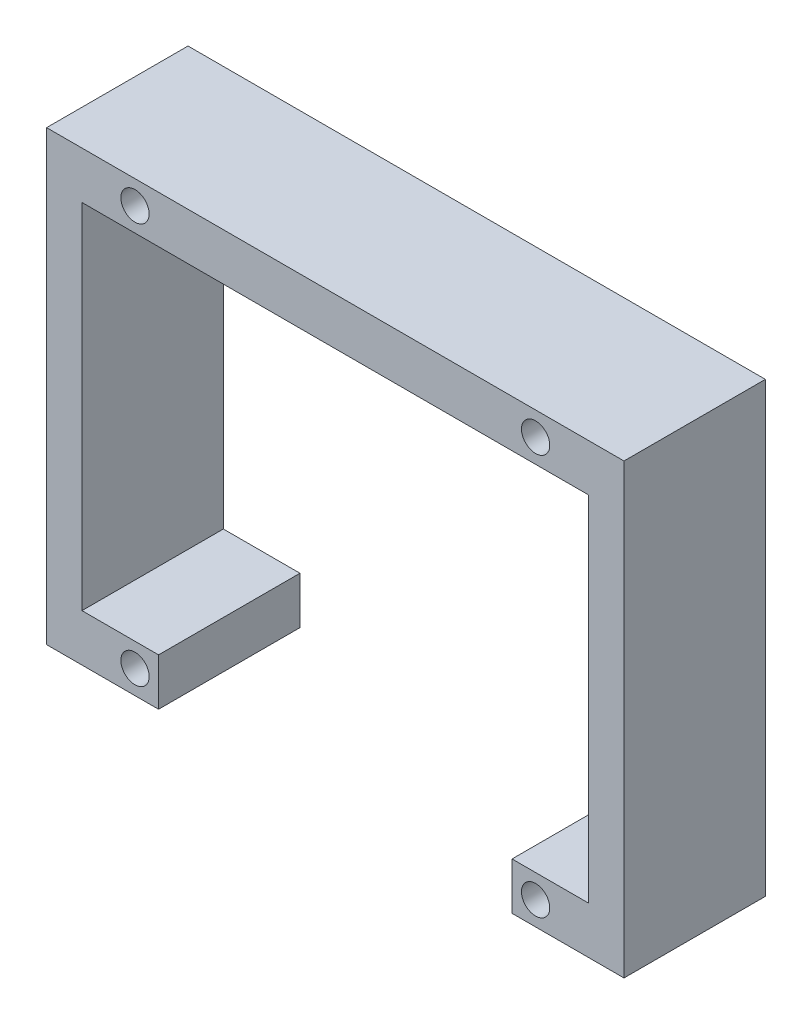
ISO-10303-21;
HEADER;
FILE_DESCRIPTION(('STEP AP214'),'2;1');
FILE_NAME('part.step','',(''),(''),'','','');
FILE_SCHEMA(('AUTOMOTIVE_DESIGN { 1 0 10303 214 1 1 1 1 }'));
ENDSEC;
DATA;
#1=APPLICATION_CONTEXT('core data for automotive mechanical design processes');
#2=APPLICATION_PROTOCOL_DEFINITION('international standard','automotive_design',2000,#1);
#3=PRODUCT_CONTEXT('',#1,'mechanical');
#4=PRODUCT('Part','Part','',(#3));
#5=PRODUCT_RELATED_PRODUCT_CATEGORY('part','',(#4));
#6=PRODUCT_DEFINITION_FORMATION('','',#4);
#7=PRODUCT_DEFINITION_CONTEXT('part definition',#1,'design');
#8=PRODUCT_DEFINITION('design','',#6,#7);
#9=PRODUCT_DEFINITION_SHAPE('','',#8);
#10=(LENGTH_UNIT() NAMED_UNIT(*) SI_UNIT(.MILLI.,.METRE.));
#11=(NAMED_UNIT(*) PLANE_ANGLE_UNIT() SI_UNIT($,.RADIAN.));
#12=(NAMED_UNIT(*) SI_UNIT($,.STERADIAN.) SOLID_ANGLE_UNIT());
#13=UNCERTAINTY_MEASURE_WITH_UNIT(LENGTH_MEASURE(1.E-05),#10,'distance_accuracy_value','');
#14=(GEOMETRIC_REPRESENTATION_CONTEXT(3) GLOBAL_UNCERTAINTY_ASSIGNED_CONTEXT((#13)) GLOBAL_UNIT_ASSIGNED_CONTEXT((#10,
#11,#12)) REPRESENTATION_CONTEXT('',''));
#15=CARTESIAN_POINT('',(0.,0.,0.));
#16=DIRECTION('',(0.,0.,1.));
#17=DIRECTION('',(1.,0.,0.));
#18=AXIS2_PLACEMENT_3D('',#15,#16,#17);
#19=CARTESIAN_POINT('',(0.,0.,12.));
#20=DIRECTION('',(0.,0.,1.));
#21=DIRECTION('',(1.,0.,0.));
#22=AXIS2_PLACEMENT_3D('',#19,#20,#21);
#23=PLANE('',#22);
#24=CARTESIAN_POINT('',(17.,17.,12.));
#25=DIRECTION('',(0.,0.,1.));
#26=DIRECTION('',(1.,0.,0.));
#27=AXIS2_PLACEMENT_3D('',#24,#25,#26);
#28=CIRCLE('',#27,1.2);
#29=CARTESIAN_POINT('',(18.2,17.,12.));
#30=VERTEX_POINT('',#29);
#31=EDGE_CURVE('E299',#30,#30,#28,.T.);
#32=ORIENTED_EDGE('',*,*,#31,.F.);
#33=EDGE_LOOP('',(#32));
#34=FACE_BOUND('',#33,.T.);
#35=CARTESIAN_POINT('',(-17.,17.,12.));
#36=DIRECTION('',(0.,0.,1.));
#37=DIRECTION('',(1.,0.,0.));
#38=AXIS2_PLACEMENT_3D('',#35,#36,#37);
#39=CIRCLE('',#38,1.2);
#40=CARTESIAN_POINT('',(-15.8,17.,12.));
#41=VERTEX_POINT('',#40);
#42=EDGE_CURVE('E166',#41,#41,#39,.T.);
#43=ORIENTED_EDGE('',*,*,#42,.F.);
#44=EDGE_LOOP('',(#43));
#45=FACE_BOUND('',#44,.T.);
#46=DIRECTION('',(1.,0.,0.));
#47=VECTOR('',#46,1.);
#48=CARTESIAN_POINT('',(-24.5,-19.,12.));
#49=LINE('',#48,#47);
#50=CARTESIAN_POINT('',(-24.5,-19.,12.));
#51=VERTEX_POINT('',#50);
#52=CARTESIAN_POINT('',(-15.,-19.,12.));
#53=VERTEX_POINT('',#52);
#54=EDGE_CURVE('E185',#51,#53,#49,.T.);
#55=ORIENTED_EDGE('',*,*,#54,.T.);
#56=DIRECTION('',(0.,1.,0.));
#57=VECTOR('',#56,1.);
#58=CARTESIAN_POINT('',(-15.,-19.,12.));
#59=LINE('',#58,#57);
#60=CARTESIAN_POINT('',(-15.,-15.,12.));
#61=VERTEX_POINT('',#60);
#62=EDGE_CURVE('E113',#53,#61,#59,.T.);
#63=ORIENTED_EDGE('',*,*,#62,.T.);
#64=DIRECTION('',(-1.,0.,0.));
#65=VECTOR('',#64,1.);
#66=CARTESIAN_POINT('',(-15.,-15.,12.));
#67=LINE('',#66,#65);
#68=CARTESIAN_POINT('',(-21.5,-15.,12.));
#69=VERTEX_POINT('',#68);
#70=EDGE_CURVE('E212',#61,#69,#67,.T.);
#71=ORIENTED_EDGE('',*,*,#70,.T.);
#72=DIRECTION('',(0.,1.,0.));
#73=VECTOR('',#72,1.);
#74=CARTESIAN_POINT('',(-21.5,-15.,12.));
#75=LINE('',#74,#73);
#76=CARTESIAN_POINT('',(-21.5,15.,12.));
#77=VERTEX_POINT('',#76);
#78=EDGE_CURVE('E231',#69,#77,#75,.T.);
#79=ORIENTED_EDGE('',*,*,#78,.T.);
#80=DIRECTION('',(1.,0.,0.));
#81=VECTOR('',#80,1.);
#82=CARTESIAN_POINT('',(-21.5,15.,12.));
#83=LINE('',#82,#81);
#84=CARTESIAN_POINT('',(21.5,15.,12.));
#85=VERTEX_POINT('',#84);
#86=EDGE_CURVE('E228',#77,#85,#83,.T.);
#87=ORIENTED_EDGE('',*,*,#86,.T.);
#88=DIRECTION('',(0.,-1.,0.));
#89=VECTOR('',#88,1.);
#90=CARTESIAN_POINT('',(21.5,15.,12.));
#91=LINE('',#90,#89);
#92=CARTESIAN_POINT('',(21.5,-15.,12.));
#93=VERTEX_POINT('',#92);
#94=EDGE_CURVE('E230',#85,#93,#91,.T.);
#95=ORIENTED_EDGE('',*,*,#94,.T.);
#96=DIRECTION('',(-1.,0.,0.));
#97=VECTOR('',#96,1.);
#98=CARTESIAN_POINT('',(21.5,-15.,12.));
#99=LINE('',#98,#97);
#100=CARTESIAN_POINT('',(15.,-15.,12.));
#101=VERTEX_POINT('',#100);
#102=EDGE_CURVE('E233',#93,#101,#99,.T.);
#103=ORIENTED_EDGE('',*,*,#102,.T.);
#104=DIRECTION('',(0.,-1.,0.));
#105=VECTOR('',#104,1.);
#106=CARTESIAN_POINT('',(15.,-15.,12.));
#107=LINE('',#106,#105);
#108=CARTESIAN_POINT('',(15.,-19.,12.));
#109=VERTEX_POINT('',#108);
#110=EDGE_CURVE('E239',#101,#109,#107,.T.);
#111=ORIENTED_EDGE('',*,*,#110,.T.);
#112=DIRECTION('',(1.,0.,0.));
#113=VECTOR('',#112,1.);
#114=CARTESIAN_POINT('',(15.,-19.,12.));
#115=LINE('',#114,#113);
#116=CARTESIAN_POINT('',(24.5,-19.,12.));
#117=VERTEX_POINT('',#116);
#118=EDGE_CURVE('E144',#109,#117,#115,.T.);
#119=ORIENTED_EDGE('',*,*,#118,.T.);
#120=DIRECTION('',(0.,1.,0.));
#121=VECTOR('',#120,1.);
#122=CARTESIAN_POINT('',(24.5,-19.,12.));
#123=LINE('',#122,#121);
#124=CARTESIAN_POINT('',(24.5,19.,12.));
#125=VERTEX_POINT('',#124);
#126=EDGE_CURVE('E138',#117,#125,#123,.T.);
#127=ORIENTED_EDGE('',*,*,#126,.T.);
#128=DIRECTION('',(-1.,0.,0.));
#129=VECTOR('',#128,1.);
#130=CARTESIAN_POINT('',(24.5,19.,12.));
#131=LINE('',#130,#129);
#132=CARTESIAN_POINT('',(-24.5,19.,12.));
#133=VERTEX_POINT('',#132);
#134=EDGE_CURVE('E142',#125,#133,#131,.T.);
#135=ORIENTED_EDGE('',*,*,#134,.T.);
#136=DIRECTION('',(0.,-1.,0.));
#137=VECTOR('',#136,1.);
#138=CARTESIAN_POINT('',(-24.5,19.,12.));
#139=LINE('',#138,#137);
#140=EDGE_CURVE('E58',#133,#51,#139,.T.);
#141=ORIENTED_EDGE('',*,*,#140,.T.);
#142=EDGE_LOOP('',(#55,#63,#71,#79,#87,#95,#103,#111,#119,#127,#135,#141));
#143=FACE_BOUND('',#142,.T.);
#144=CARTESIAN_POINT('',(-17.,-17.,12.));
#145=DIRECTION('',(0.,0.,1.));
#146=DIRECTION('',(1.,0.,0.));
#147=AXIS2_PLACEMENT_3D('',#144,#145,#146);
#148=CIRCLE('',#147,1.2);
#149=CARTESIAN_POINT('',(-15.8,-17.,12.));
#150=VERTEX_POINT('',#149);
#151=EDGE_CURVE('E305',#150,#150,#148,.T.);
#152=ORIENTED_EDGE('',*,*,#151,.F.);
#153=EDGE_LOOP('',(#152));
#154=FACE_BOUND('',#153,.T.);
#155=CARTESIAN_POINT('',(17.,-17.,12.));
#156=DIRECTION('',(0.,0.,1.));
#157=DIRECTION('',(1.,0.,0.));
#158=AXIS2_PLACEMENT_3D('',#155,#156,#157);
#159=CIRCLE('',#158,1.2);
#160=CARTESIAN_POINT('',(18.2,-17.,12.));
#161=VERTEX_POINT('',#160);
#162=EDGE_CURVE('E290',#161,#161,#159,.T.);
#163=ORIENTED_EDGE('',*,*,#162,.F.);
#164=EDGE_LOOP('',(#163));
#165=FACE_BOUND('',#164,.T.);
#166=ADVANCED_FACE('F41',(#34,#45,#143,#154,#165),#23,.T.);
#167=CARTESIAN_POINT('',(0.,0.,0.));
#168=DIRECTION('',(0.,0.,1.));
#169=DIRECTION('',(1.,0.,0.));
#170=AXIS2_PLACEMENT_3D('',#167,#168,#169);
#171=PLANE('',#170);
#172=DIRECTION('',(1.,0.,0.));
#173=VECTOR('',#172,1.);
#174=CARTESIAN_POINT('',(-24.5,-19.,0.));
#175=LINE('',#174,#173);
#176=CARTESIAN_POINT('',(-24.5,-19.,0.));
#177=VERTEX_POINT('',#176);
#178=CARTESIAN_POINT('',(-15.,-19.,0.));
#179=VERTEX_POINT('',#178);
#180=EDGE_CURVE('E162',#177,#179,#175,.T.);
#181=ORIENTED_EDGE('',*,*,#180,.F.);
#182=DIRECTION('',(0.,-1.,0.));
#183=VECTOR('',#182,1.);
#184=CARTESIAN_POINT('',(-24.5,19.,0.));
#185=LINE('',#184,#183);
#186=CARTESIAN_POINT('',(-24.5,19.,0.));
#187=VERTEX_POINT('',#186);
#188=EDGE_CURVE('E105',#187,#177,#185,.T.);
#189=ORIENTED_EDGE('',*,*,#188,.F.);
#190=DIRECTION('',(-1.,0.,0.));
#191=VECTOR('',#190,1.);
#192=CARTESIAN_POINT('',(24.5,19.,0.));
#193=LINE('',#192,#191);
#194=CARTESIAN_POINT('',(24.5,19.,0.));
#195=VERTEX_POINT('',#194);
#196=EDGE_CURVE('E99',#195,#187,#193,.T.);
#197=ORIENTED_EDGE('',*,*,#196,.F.);
#198=DIRECTION('',(0.,1.,0.));
#199=VECTOR('',#198,1.);
#200=CARTESIAN_POINT('',(24.5,-19.,0.));
#201=LINE('',#200,#199);
#202=CARTESIAN_POINT('',(24.5,-19.,0.));
#203=VERTEX_POINT('',#202);
#204=EDGE_CURVE('E152',#203,#195,#201,.T.);
#205=ORIENTED_EDGE('',*,*,#204,.F.);
#206=DIRECTION('',(1.,0.,0.));
#207=VECTOR('',#206,1.);
#208=CARTESIAN_POINT('',(15.,-19.,0.));
#209=LINE('',#208,#207);
#210=CARTESIAN_POINT('',(15.,-19.,0.));
#211=VERTEX_POINT('',#210);
#212=EDGE_CURVE('E180',#211,#203,#209,.T.);
#213=ORIENTED_EDGE('',*,*,#212,.F.);
#214=DIRECTION('',(0.,-1.,0.));
#215=VECTOR('',#214,1.);
#216=CARTESIAN_POINT('',(15.,-15.,0.));
#217=LINE('',#216,#215);
#218=CARTESIAN_POINT('',(15.,-15.,0.));
#219=VERTEX_POINT('',#218);
#220=EDGE_CURVE('E178',#219,#211,#217,.T.);
#221=ORIENTED_EDGE('',*,*,#220,.F.);
#222=DIRECTION('',(-1.,0.,0.));
#223=VECTOR('',#222,1.);
#224=CARTESIAN_POINT('',(21.5,-15.,0.));
#225=LINE('',#224,#223);
#226=CARTESIAN_POINT('',(21.5,-15.,0.));
#227=VERTEX_POINT('',#226);
#228=EDGE_CURVE('E176',#227,#219,#225,.T.);
#229=ORIENTED_EDGE('',*,*,#228,.F.);
#230=DIRECTION('',(0.,-1.,0.));
#231=VECTOR('',#230,1.);
#232=CARTESIAN_POINT('',(21.5,15.,0.));
#233=LINE('',#232,#231);
#234=CARTESIAN_POINT('',(21.5,15.,0.));
#235=VERTEX_POINT('',#234);
#236=EDGE_CURVE('E174',#235,#227,#233,.T.);
#237=ORIENTED_EDGE('',*,*,#236,.F.);
#238=DIRECTION('',(1.,0.,0.));
#239=VECTOR('',#238,1.);
#240=CARTESIAN_POINT('',(-21.5,15.,0.));
#241=LINE('',#240,#239);
#242=CARTESIAN_POINT('',(-21.5,15.,0.));
#243=VERTEX_POINT('',#242);
#244=EDGE_CURVE('E172',#243,#235,#241,.T.);
#245=ORIENTED_EDGE('',*,*,#244,.F.);
#246=DIRECTION('',(0.,1.,0.));
#247=VECTOR('',#246,1.);
#248=CARTESIAN_POINT('',(-21.5,-15.,0.));
#249=LINE('',#248,#247);
#250=CARTESIAN_POINT('',(-21.5,-15.,0.));
#251=VERTEX_POINT('',#250);
#252=EDGE_CURVE('E170',#251,#243,#249,.T.);
#253=ORIENTED_EDGE('',*,*,#252,.F.);
#254=DIRECTION('',(-1.,0.,0.));
#255=VECTOR('',#254,1.);
#256=CARTESIAN_POINT('',(-15.,-15.,0.));
#257=LINE('',#256,#255);
#258=CARTESIAN_POINT('',(-15.,-15.,0.));
#259=VERTEX_POINT('',#258);
#260=EDGE_CURVE('E168',#259,#251,#257,.T.);
#261=ORIENTED_EDGE('',*,*,#260,.F.);
#262=DIRECTION('',(0.,1.,0.));
#263=VECTOR('',#262,1.);
#264=CARTESIAN_POINT('',(-15.,-19.,0.));
#265=LINE('',#264,#263);
#266=EDGE_CURVE('E165',#179,#259,#265,.T.);
#267=ORIENTED_EDGE('',*,*,#266,.F.);
#268=EDGE_LOOP('',(#181,#189,#197,#205,#213,#221,#229,#237,#245,#253,#261,#267));
#269=FACE_BOUND('',#268,.T.);
#270=CARTESIAN_POINT('',(-17.,17.,0.));
#271=DIRECTION('',(0.,0.,1.));
#272=DIRECTION('',(1.,0.,0.));
#273=AXIS2_PLACEMENT_3D('',#270,#271,#272);
#274=CIRCLE('',#273,1.2);
#275=CARTESIAN_POINT('',(-15.8,17.,0.));
#276=VERTEX_POINT('',#275);
#277=EDGE_CURVE('E308',#276,#276,#274,.T.);
#278=ORIENTED_EDGE('',*,*,#277,.T.);
#279=EDGE_LOOP('',(#278));
#280=FACE_BOUND('',#279,.T.);
#281=CARTESIAN_POINT('',(-17.,-17.,0.));
#282=DIRECTION('',(0.,0.,1.));
#283=DIRECTION('',(1.,0.,0.));
#284=AXIS2_PLACEMENT_3D('',#281,#282,#283);
#285=CIRCLE('',#284,1.2);
#286=CARTESIAN_POINT('',(-15.8,-17.,0.));
#287=VERTEX_POINT('',#286);
#288=EDGE_CURVE('E302',#287,#287,#285,.T.);
#289=ORIENTED_EDGE('',*,*,#288,.T.);
#290=EDGE_LOOP('',(#289));
#291=FACE_BOUND('',#290,.T.);
#292=CARTESIAN_POINT('',(17.,17.,0.));
#293=DIRECTION('',(0.,0.,1.));
#294=DIRECTION('',(1.,0.,0.));
#295=AXIS2_PLACEMENT_3D('',#292,#293,#294);
#296=CIRCLE('',#295,1.2);
#297=CARTESIAN_POINT('',(18.2,17.,0.));
#298=VERTEX_POINT('',#297);
#299=EDGE_CURVE('E296',#298,#298,#296,.T.);
#300=ORIENTED_EDGE('',*,*,#299,.T.);
#301=EDGE_LOOP('',(#300));
#302=FACE_BOUND('',#301,.T.);
#303=CARTESIAN_POINT('',(17.,-17.,0.));
#304=DIRECTION('',(0.,0.,1.));
#305=DIRECTION('',(1.,0.,0.));
#306=AXIS2_PLACEMENT_3D('',#303,#304,#305);
#307=CIRCLE('',#306,1.2);
#308=CARTESIAN_POINT('',(18.2,-17.,0.));
#309=VERTEX_POINT('',#308);
#310=EDGE_CURVE('E293',#309,#309,#307,.T.);
#311=ORIENTED_EDGE('',*,*,#310,.T.);
#312=EDGE_LOOP('',(#311));
#313=FACE_BOUND('',#312,.T.);
#314=ADVANCED_FACE('F216',(#269,#280,#291,#302,#313),#171,.F.);
#315=CARTESIAN_POINT('',(-24.5,-19.,12.));
#316=DIRECTION('',(0.,1.,0.));
#317=DIRECTION('',(0.,0.,1.));
#318=AXIS2_PLACEMENT_3D('',#315,#316,#317);
#319=PLANE('',#318);
#320=ORIENTED_EDGE('',*,*,#180,.T.);
#321=DIRECTION('',(0.,0.,-1.));
#322=VECTOR('',#321,1.);
#323=CARTESIAN_POINT('',(-15.,-19.,12.));
#324=LINE('',#323,#322);
#325=EDGE_CURVE('E11',#53,#179,#324,.T.);
#326=ORIENTED_EDGE('',*,*,#325,.F.);
#327=ORIENTED_EDGE('',*,*,#54,.F.);
#328=DIRECTION('',(0.,0.,-1.));
#329=VECTOR('',#328,1.);
#330=CARTESIAN_POINT('',(-24.5,-19.,12.));
#331=LINE('',#330,#329);
#332=EDGE_CURVE('E158',#51,#177,#331,.T.);
#333=ORIENTED_EDGE('',*,*,#332,.T.);
#334=EDGE_LOOP('',(#320,#326,#327,#333));
#335=FACE_BOUND('',#334,.T.);
#336=ADVANCED_FACE('F43',(#335),#319,.F.);
#337=CARTESIAN_POINT('',(-15.,-19.,12.));
#338=DIRECTION('',(-1.,0.,0.));
#339=DIRECTION('',(0.,0.,1.));
#340=AXIS2_PLACEMENT_3D('',#337,#338,#339);
#341=PLANE('',#340);
#342=ORIENTED_EDGE('',*,*,#266,.T.);
#343=DIRECTION('',(0.,0.,-1.));
#344=VECTOR('',#343,1.);
#345=CARTESIAN_POINT('',(-15.,-15.,12.));
#346=LINE('',#345,#344);
#347=EDGE_CURVE('E50',#61,#259,#346,.T.);
#348=ORIENTED_EDGE('',*,*,#347,.F.);
#349=ORIENTED_EDGE('',*,*,#62,.F.);
#350=ORIENTED_EDGE('',*,*,#325,.T.);
#351=EDGE_LOOP('',(#342,#348,#349,#350));
#352=FACE_BOUND('',#351,.T.);
#353=ADVANCED_FACE('F422',(#352),#341,.F.);
#354=CARTESIAN_POINT('',(-15.,-15.,12.));
#355=DIRECTION('',(0.,-1.,0.));
#356=DIRECTION('',(1.,0.,0.));
#357=AXIS2_PLACEMENT_3D('',#354,#355,#356);
#358=PLANE('',#357);
#359=ORIENTED_EDGE('',*,*,#260,.T.);
#360=DIRECTION('',(0.,0.,-1.));
#361=VECTOR('',#360,1.);
#362=CARTESIAN_POINT('',(-21.5,-15.,12.));
#363=LINE('',#362,#361);
#364=EDGE_CURVE('E204',#69,#251,#363,.T.);
#365=ORIENTED_EDGE('',*,*,#364,.F.);
#366=ORIENTED_EDGE('',*,*,#70,.F.);
#367=ORIENTED_EDGE('',*,*,#347,.T.);
#368=EDGE_LOOP('',(#359,#365,#366,#367));
#369=FACE_BOUND('',#368,.T.);
#370=ADVANCED_FACE('F210',(#369),#358,.F.);
#371=CARTESIAN_POINT('',(-21.5,-15.,12.));
#372=DIRECTION('',(-1.,0.,0.));
#373=DIRECTION('',(0.,0.,1.));
#374=AXIS2_PLACEMENT_3D('',#371,#372,#373);
#375=PLANE('',#374);
#376=ORIENTED_EDGE('',*,*,#252,.T.);
#377=DIRECTION('',(0.,0.,-1.));
#378=VECTOR('',#377,1.);
#379=CARTESIAN_POINT('',(-21.5,15.,12.));
#380=LINE('',#379,#378);
#381=EDGE_CURVE('E201',#77,#243,#380,.T.);
#382=ORIENTED_EDGE('',*,*,#381,.F.);
#383=ORIENTED_EDGE('',*,*,#78,.F.);
#384=ORIENTED_EDGE('',*,*,#364,.T.);
#385=EDGE_LOOP('',(#376,#382,#383,#384));
#386=FACE_BOUND('',#385,.T.);
#387=ADVANCED_FACE('F222',(#386),#375,.F.);
#388=CARTESIAN_POINT('',(-21.5,15.,12.));
#389=DIRECTION('',(0.,1.,0.));
#390=DIRECTION('',(0.,0.,1.));
#391=AXIS2_PLACEMENT_3D('',#388,#389,#390);
#392=PLANE('',#391);
#393=ORIENTED_EDGE('',*,*,#244,.T.);
#394=DIRECTION('',(0.,0.,-1.));
#395=VECTOR('',#394,1.);
#396=CARTESIAN_POINT('',(21.5,15.,12.));
#397=LINE('',#396,#395);
#398=EDGE_CURVE('E198',#85,#235,#397,.T.);
#399=ORIENTED_EDGE('',*,*,#398,.F.);
#400=ORIENTED_EDGE('',*,*,#86,.F.);
#401=ORIENTED_EDGE('',*,*,#381,.T.);
#402=EDGE_LOOP('',(#393,#399,#400,#401));
#403=FACE_BOUND('',#402,.T.);
#404=ADVANCED_FACE('F226',(#403),#392,.F.);
#405=CARTESIAN_POINT('',(21.5,15.,12.));
#406=DIRECTION('',(1.,0.,0.));
#407=DIRECTION('',(0.,0.,-1.));
#408=AXIS2_PLACEMENT_3D('',#405,#406,#407);
#409=PLANE('',#408);
#410=ORIENTED_EDGE('',*,*,#236,.T.);
#411=DIRECTION('',(0.,0.,-1.));
#412=VECTOR('',#411,1.);
#413=CARTESIAN_POINT('',(21.5,-15.,12.));
#414=LINE('',#413,#412);
#415=EDGE_CURVE('E195',#93,#227,#414,.T.);
#416=ORIENTED_EDGE('',*,*,#415,.F.);
#417=ORIENTED_EDGE('',*,*,#94,.F.);
#418=ORIENTED_EDGE('',*,*,#398,.T.);
#419=EDGE_LOOP('',(#410,#416,#417,#418));
#420=FACE_BOUND('',#419,.T.);
#421=ADVANCED_FACE('F387',(#420),#409,.F.);
#422=CARTESIAN_POINT('',(21.5,-15.,12.));
#423=DIRECTION('',(0.,-1.,0.));
#424=DIRECTION('',(0.,0.,-1.));
#425=AXIS2_PLACEMENT_3D('',#422,#423,#424);
#426=PLANE('',#425);
#427=ORIENTED_EDGE('',*,*,#228,.T.);
#428=DIRECTION('',(0.,0.,-1.));
#429=VECTOR('',#428,1.);
#430=CARTESIAN_POINT('',(15.,-15.,12.));
#431=LINE('',#430,#429);
#432=EDGE_CURVE('E192',#101,#219,#431,.T.);
#433=ORIENTED_EDGE('',*,*,#432,.F.);
#434=ORIENTED_EDGE('',*,*,#102,.F.);
#435=ORIENTED_EDGE('',*,*,#415,.T.);
#436=EDGE_LOOP('',(#427,#433,#434,#435));
#437=FACE_BOUND('',#436,.T.);
#438=ADVANCED_FACE('F378',(#437),#426,.F.);
#439=CARTESIAN_POINT('',(15.,-15.,12.));
#440=DIRECTION('',(1.,0.,0.));
#441=DIRECTION('',(0.,1.,0.));
#442=AXIS2_PLACEMENT_3D('',#439,#440,#441);
#443=PLANE('',#442);
#444=ORIENTED_EDGE('',*,*,#220,.T.);
#445=DIRECTION('',(0.,0.,-1.));
#446=VECTOR('',#445,1.);
#447=CARTESIAN_POINT('',(15.,-19.,12.));
#448=LINE('',#447,#446);
#449=EDGE_CURVE('E189',#109,#211,#448,.T.);
#450=ORIENTED_EDGE('',*,*,#449,.F.);
#451=ORIENTED_EDGE('',*,*,#110,.F.);
#452=ORIENTED_EDGE('',*,*,#432,.T.);
#453=EDGE_LOOP('',(#444,#450,#451,#452));
#454=FACE_BOUND('',#453,.T.);
#455=ADVANCED_FACE('F245',(#454),#443,.F.);
#456=CARTESIAN_POINT('',(15.,-19.,12.));
#457=DIRECTION('',(0.,1.,0.));
#458=DIRECTION('',(-1.,0.,0.));
#459=AXIS2_PLACEMENT_3D('',#456,#457,#458);
#460=PLANE('',#459);
#461=ORIENTED_EDGE('',*,*,#212,.T.);
#462=DIRECTION('',(0.,0.,-1.));
#463=VECTOR('',#462,1.);
#464=CARTESIAN_POINT('',(24.5,-19.,12.));
#465=LINE('',#464,#463);
#466=EDGE_CURVE('E153',#117,#203,#465,.T.);
#467=ORIENTED_EDGE('',*,*,#466,.F.);
#468=ORIENTED_EDGE('',*,*,#118,.F.);
#469=ORIENTED_EDGE('',*,*,#449,.T.);
#470=EDGE_LOOP('',(#461,#467,#468,#469));
#471=FACE_BOUND('',#470,.T.);
#472=ADVANCED_FACE('F249',(#471),#460,.F.);
#473=CARTESIAN_POINT('',(24.5,-19.,12.));
#474=DIRECTION('',(-1.,0.,0.));
#475=DIRECTION('',(0.,-1.,0.));
#476=AXIS2_PLACEMENT_3D('',#473,#474,#475);
#477=PLANE('',#476);
#478=ORIENTED_EDGE('',*,*,#204,.T.);
#479=DIRECTION('',(0.,0.,-1.));
#480=VECTOR('',#479,1.);
#481=CARTESIAN_POINT('',(24.5,19.,12.));
#482=LINE('',#481,#480);
#483=EDGE_CURVE('E149',#125,#195,#482,.T.);
#484=ORIENTED_EDGE('',*,*,#483,.F.);
#485=ORIENTED_EDGE('',*,*,#126,.F.);
#486=ORIENTED_EDGE('',*,*,#466,.T.);
#487=EDGE_LOOP('',(#478,#484,#485,#486));
#488=FACE_BOUND('',#487,.T.);
#489=ADVANCED_FACE('F150',(#488),#477,.F.);
#490=CARTESIAN_POINT('',(24.5,19.,12.));
#491=DIRECTION('',(0.,-1.,0.));
#492=DIRECTION('',(0.,0.,-1.));
#493=AXIS2_PLACEMENT_3D('',#490,#491,#492);
#494=PLANE('',#493);
#495=ORIENTED_EDGE('',*,*,#196,.T.);
#496=DIRECTION('',(0.,0.,-1.));
#497=VECTOR('',#496,1.);
#498=CARTESIAN_POINT('',(-24.5,19.,12.));
#499=LINE('',#498,#497);
#500=EDGE_CURVE('E154',#133,#187,#499,.T.);
#501=ORIENTED_EDGE('',*,*,#500,.F.);
#502=ORIENTED_EDGE('',*,*,#134,.F.);
#503=ORIENTED_EDGE('',*,*,#483,.T.);
#504=EDGE_LOOP('',(#495,#501,#502,#503));
#505=FACE_BOUND('',#504,.T.);
#506=ADVANCED_FACE('F156',(#505),#494,.F.);
#507=CARTESIAN_POINT('',(-24.5,19.,12.));
#508=DIRECTION('',(1.,0.,0.));
#509=DIRECTION('',(0.,1.,0.));
#510=AXIS2_PLACEMENT_3D('',#507,#508,#509);
#511=PLANE('',#510);
#512=ORIENTED_EDGE('',*,*,#188,.T.);
#513=ORIENTED_EDGE('',*,*,#332,.F.);
#514=ORIENTED_EDGE('',*,*,#140,.F.);
#515=ORIENTED_EDGE('',*,*,#500,.T.);
#516=EDGE_LOOP('',(#512,#513,#514,#515));
#517=FACE_BOUND('',#516,.T.);
#518=ADVANCED_FACE('F253',(#517),#511,.F.);
#519=CARTESIAN_POINT('',(-17.,17.,12.));
#520=DIRECTION('',(0.,0.,-1.));
#521=DIRECTION('',(-1.,0.,0.));
#522=AXIS2_PLACEMENT_3D('',#519,#520,#521);
#523=CYLINDRICAL_SURFACE('',#522,1.2);
#524=ORIENTED_EDGE('',*,*,#42,.T.);
#525=EDGE_LOOP('',(#524));
#526=FACE_BOUND('',#525,.T.);
#527=ORIENTED_EDGE('',*,*,#277,.F.);
#528=EDGE_LOOP('',(#527));
#529=FACE_BOUND('',#528,.T.);
#530=ADVANCED_FACE('F255',(#526,#529),#523,.F.);
#531=CARTESIAN_POINT('',(-17.,-17.,12.));
#532=DIRECTION('',(0.,0.,-1.));
#533=DIRECTION('',(-1.,0.,0.));
#534=AXIS2_PLACEMENT_3D('',#531,#532,#533);
#535=CYLINDRICAL_SURFACE('',#534,1.2);
#536=ORIENTED_EDGE('',*,*,#151,.T.);
#537=EDGE_LOOP('',(#536));
#538=FACE_BOUND('',#537,.T.);
#539=ORIENTED_EDGE('',*,*,#288,.F.);
#540=EDGE_LOOP('',(#539));
#541=FACE_BOUND('',#540,.T.);
#542=ADVANCED_FACE('F261',(#538,#541),#535,.F.);
#543=CARTESIAN_POINT('',(17.,17.,12.));
#544=DIRECTION('',(0.,0.,-1.));
#545=DIRECTION('',(-1.,0.,0.));
#546=AXIS2_PLACEMENT_3D('',#543,#544,#545);
#547=CYLINDRICAL_SURFACE('',#546,1.2);
#548=ORIENTED_EDGE('',*,*,#31,.T.);
#549=EDGE_LOOP('',(#548));
#550=FACE_BOUND('',#549,.T.);
#551=ORIENTED_EDGE('',*,*,#299,.F.);
#552=EDGE_LOOP('',(#551));
#553=FACE_BOUND('',#552,.T.);
#554=ADVANCED_FACE('F277',(#550,#553),#547,.F.);
#555=CARTESIAN_POINT('',(17.,-17.,12.));
#556=DIRECTION('',(0.,0.,-1.));
#557=DIRECTION('',(-1.,0.,0.));
#558=AXIS2_PLACEMENT_3D('',#555,#556,#557);
#559=CYLINDRICAL_SURFACE('',#558,1.2);
#560=ORIENTED_EDGE('',*,*,#162,.T.);
#561=EDGE_LOOP('',(#560));
#562=FACE_BOUND('',#561,.T.);
#563=ORIENTED_EDGE('',*,*,#310,.F.);
#564=EDGE_LOOP('',(#563));
#565=FACE_BOUND('',#564,.T.);
#566=ADVANCED_FACE('F281',(#562,#565),#559,.F.);
#567=CLOSED_SHELL('',(#166,#314,#336,#353,#370,#387,#404,#421,#438,#455,#472,#489,#506,#518,
#530,#542,#554,#566));
#568=MANIFOLD_SOLID_BREP('B2',#567);
#569=ADVANCED_BREP_SHAPE_REPRESENTATION('',(#18,#568),#14);
#570=SHAPE_DEFINITION_REPRESENTATION(#9,#569);
ENDSEC;
END-ISO-10303-21;
